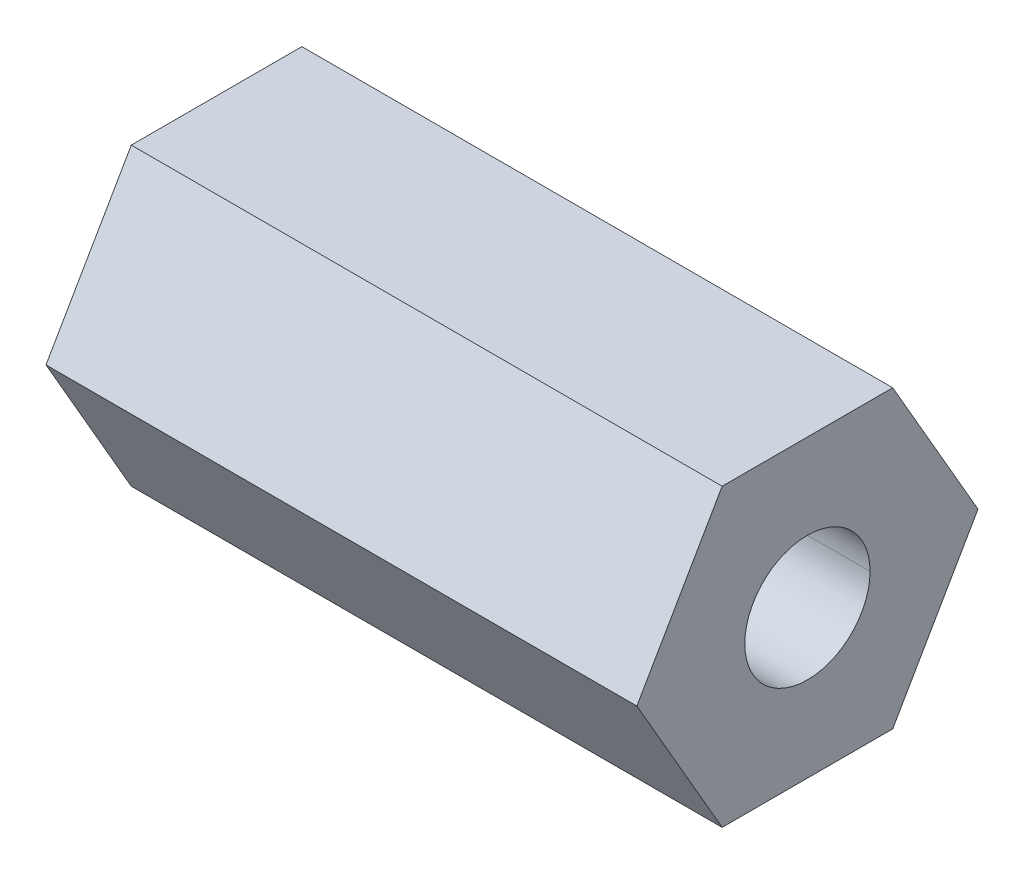
ISO-10303-21;
HEADER;
FILE_DESCRIPTION(('STEP AP214'),'2;1');
FILE_NAME('part.step','',(''),(''),'','','');
FILE_SCHEMA(('AUTOMOTIVE_DESIGN { 1 0 10303 214 1 1 1 1 }'));
ENDSEC;
DATA;
#1=APPLICATION_CONTEXT('core data for automotive mechanical design processes');
#2=APPLICATION_PROTOCOL_DEFINITION('international standard','automotive_design',2000,#1);
#3=PRODUCT_CONTEXT('',#1,'mechanical');
#4=PRODUCT('Part','Part','',(#3));
#5=PRODUCT_RELATED_PRODUCT_CATEGORY('part','',(#4));
#6=PRODUCT_DEFINITION_FORMATION('','',#4);
#7=PRODUCT_DEFINITION_CONTEXT('part definition',#1,'design');
#8=PRODUCT_DEFINITION('design','',#6,#7);
#9=PRODUCT_DEFINITION_SHAPE('','',#8);
#10=(LENGTH_UNIT() NAMED_UNIT(*) SI_UNIT(.MILLI.,.METRE.));
#11=(NAMED_UNIT(*) PLANE_ANGLE_UNIT() SI_UNIT($,.RADIAN.));
#12=(NAMED_UNIT(*) SI_UNIT($,.STERADIAN.) SOLID_ANGLE_UNIT());
#13=UNCERTAINTY_MEASURE_WITH_UNIT(LENGTH_MEASURE(1.E-05),#10,'distance_accuracy_value','');
#14=(GEOMETRIC_REPRESENTATION_CONTEXT(3) GLOBAL_UNCERTAINTY_ASSIGNED_CONTEXT((#13)) GLOBAL_UNIT_ASSIGNED_CONTEXT((#10,
#11,#12)) REPRESENTATION_CONTEXT('',''));
#15=CARTESIAN_POINT('',(0.,0.,0.));
#16=DIRECTION('',(0.,0.,1.));
#17=DIRECTION('',(1.,0.,0.));
#18=AXIS2_PLACEMENT_3D('',#15,#16,#17);
#19=CARTESIAN_POINT('',(38.1,-4.7625,-2.74963065701564));
#20=DIRECTION('',(0.,0.5,0.866025403784442));
#21=DIRECTION('',(1.,0.,0.));
#22=AXIS2_PLACEMENT_3D('',#19,#20,#21);
#23=PLANE('',#22);
#24=DIRECTION('',(0.,-0.866025403784444,0.499999999999991));
#25=VECTOR('',#24,1.);
#26=CARTESIAN_POINT('',(-19.05,-4.7625,-2.74963065701564));
#27=LINE('',#26,#25);
#28=CARTESIAN_POINT('',(-19.05,0.,-5.49926131403117));
#29=VERTEX_POINT('',#28);
#30=CARTESIAN_POINT('',(-19.05,-4.7625,-2.74963065701564));
#31=VERTEX_POINT('',#30);
#32=EDGE_CURVE('E46',#29,#31,#27,.T.);
#33=ORIENTED_EDGE('',*,*,#32,.T.);
#34=DIRECTION('',(-1.,0.,0.));
#35=VECTOR('',#34,1.);
#36=CARTESIAN_POINT('',(38.1,-4.7625,-2.74963065701564));
#37=LINE('',#36,#35);
#38=CARTESIAN_POINT('',(-38.1,-4.7625,-2.74963065701564));
#39=VERTEX_POINT('',#38);
#40=EDGE_CURVE('E128',#31,#39,#37,.T.);
#41=ORIENTED_EDGE('',*,*,#40,.T.);
#42=DIRECTION('',(0.,0.866025403784442,-0.5));
#43=VECTOR('',#42,1.);
#44=CARTESIAN_POINT('',(-38.1,-4.7625,-2.74963065701564));
#45=LINE('',#44,#43);
#46=CARTESIAN_POINT('',(-38.1,0.,-5.49926131403117));
#47=VERTEX_POINT('',#46);
#48=EDGE_CURVE('E160',#39,#47,#45,.T.);
#49=ORIENTED_EDGE('',*,*,#48,.T.);
#50=DIRECTION('',(-1.,0.,0.));
#51=VECTOR('',#50,1.);
#52=CARTESIAN_POINT('',(38.1,0.,-5.49926131403117));
#53=LINE('',#52,#51);
#54=EDGE_CURVE('E154',#29,#47,#53,.T.);
#55=ORIENTED_EDGE('',*,*,#54,.F.);
#56=EDGE_LOOP('',(#33,#41,#49,#55));
#57=FACE_BOUND('',#56,.T.);
#58=ADVANCED_FACE('F42',(#57),#23,.F.);
#59=CARTESIAN_POINT('',(38.1,0.,-5.49926131403117));
#60=DIRECTION('',(0.,-0.5,0.866025403784438));
#61=DIRECTION('',(-1.,0.,0.));
#62=AXIS2_PLACEMENT_3D('',#59,#60,#61);
#63=PLANE('',#62);
#64=DIRECTION('',(0.,-0.866025403784438,-0.500000000000001));
#65=VECTOR('',#64,1.);
#66=CARTESIAN_POINT('',(-19.05,0.,-5.49926131403117));
#67=LINE('',#66,#65);
#68=CARTESIAN_POINT('',(-19.05,4.7625,-2.74963065701557));
#69=VERTEX_POINT('',#68);
#70=EDGE_CURVE('E157',#69,#29,#67,.T.);
#71=ORIENTED_EDGE('',*,*,#70,.T.);
#72=ORIENTED_EDGE('',*,*,#54,.T.);
#73=DIRECTION('',(0.,0.866025403784438,0.5));
#74=VECTOR('',#73,1.);
#75=CARTESIAN_POINT('',(-38.1,0.,-5.49926131403117));
#76=LINE('',#75,#74);
#77=CARTESIAN_POINT('',(-38.1,4.7625,-2.74963065701557));
#78=VERTEX_POINT('',#77);
#79=EDGE_CURVE('E143',#47,#78,#76,.T.);
#80=ORIENTED_EDGE('',*,*,#79,.T.);
#81=DIRECTION('',(-1.,0.,0.));
#82=VECTOR('',#81,1.);
#83=CARTESIAN_POINT('',(38.1,4.7625,-2.74963065701557));
#84=LINE('',#83,#82);
#85=EDGE_CURVE('E146',#69,#78,#84,.T.);
#86=ORIENTED_EDGE('',*,*,#85,.F.);
#87=EDGE_LOOP('',(#71,#72,#80,#86));
#88=FACE_BOUND('',#87,.T.);
#89=ADVANCED_FACE('F334',(#88),#63,.F.);
#90=CARTESIAN_POINT('',(38.1,4.7625,-2.74963065701557));
#91=DIRECTION('',(0.,-1.,0.));
#92=DIRECTION('',(0.,0.,-1.));
#93=AXIS2_PLACEMENT_3D('',#90,#91,#92);
#94=PLANE('',#93);
#95=DIRECTION('',(0.,0.,-1.));
#96=VECTOR('',#95,1.);
#97=CARTESIAN_POINT('',(-19.05,4.7625,-2.74963065701557));
#98=LINE('',#97,#96);
#99=CARTESIAN_POINT('',(-19.05,4.7625,2.74963065701561));
#100=VERTEX_POINT('',#99);
#101=EDGE_CURVE('E150',#100,#69,#98,.T.);
#102=ORIENTED_EDGE('',*,*,#101,.T.);
#103=ORIENTED_EDGE('',*,*,#85,.T.);
#104=DIRECTION('',(0.,0.,1.));
#105=VECTOR('',#104,1.);
#106=CARTESIAN_POINT('',(-38.1,4.7625,-2.74963065701557));
#107=LINE('',#106,#105);
#108=CARTESIAN_POINT('',(-38.1,4.7625,2.7496306570156));
#109=VERTEX_POINT('',#108);
#110=EDGE_CURVE('E149',#78,#109,#107,.T.);
#111=ORIENTED_EDGE('',*,*,#110,.T.);
#112=DIRECTION('',(-1.,0.,0.));
#113=VECTOR('',#112,1.);
#114=CARTESIAN_POINT('',(38.1,4.7625,2.7496306570156));
#115=LINE('',#114,#113);
#116=EDGE_CURVE('E151',#100,#109,#115,.T.);
#117=ORIENTED_EDGE('',*,*,#116,.F.);
#118=EDGE_LOOP('',(#102,#103,#111,#117));
#119=FACE_BOUND('',#118,.T.);
#120=ADVANCED_FACE('F324',(#119),#94,.F.);
#121=CARTESIAN_POINT('',(38.1,4.7625,2.7496306570156));
#122=DIRECTION('',(0.,-0.5,-0.866025403784442));
#123=DIRECTION('',(0.,-0.866025403784442,0.5));
#124=AXIS2_PLACEMENT_3D('',#121,#122,#123);
#125=PLANE('',#124);
#126=DIRECTION('',(0.,0.866025403784443,-0.499999999999993));
#127=VECTOR('',#126,1.);
#128=CARTESIAN_POINT('',(-19.05,4.7625,2.7496306570156));
#129=LINE('',#128,#127);
#130=CARTESIAN_POINT('',(-19.05,0.,5.49926131403117));
#131=VERTEX_POINT('',#130);
#132=EDGE_CURVE('E115',#131,#100,#129,.T.);
#133=ORIENTED_EDGE('',*,*,#132,.T.);
#134=ORIENTED_EDGE('',*,*,#116,.T.);
#135=DIRECTION('',(0.,-0.866025403784442,0.5));
#136=VECTOR('',#135,1.);
#137=CARTESIAN_POINT('',(-38.1,4.7625,2.7496306570156));
#138=LINE('',#137,#136);
#139=CARTESIAN_POINT('',(-38.1,0.,5.49926131403117));
#140=VERTEX_POINT('',#139);
#141=EDGE_CURVE('E120',#109,#140,#138,.T.);
#142=ORIENTED_EDGE('',*,*,#141,.T.);
#143=DIRECTION('',(-1.,0.,0.));
#144=VECTOR('',#143,1.);
#145=CARTESIAN_POINT('',(38.1,0.,5.49926131403117));
#146=LINE('',#145,#144);
#147=EDGE_CURVE('E119',#131,#140,#146,.T.);
#148=ORIENTED_EDGE('',*,*,#147,.F.);
#149=EDGE_LOOP('',(#133,#134,#142,#148));
#150=FACE_BOUND('',#149,.T.);
#151=ADVANCED_FACE('F316',(#150),#125,.F.);
#152=CARTESIAN_POINT('',(38.1,0.,5.49926131403117));
#153=DIRECTION('',(0.,0.500000000000007,-0.866025403784435));
#154=DIRECTION('',(-1.,0.,0.));
#155=AXIS2_PLACEMENT_3D('',#152,#153,#154);
#156=PLANE('',#155);
#157=DIRECTION('',(0.,0.866025403784434,0.500000000000008));
#158=VECTOR('',#157,1.);
#159=CARTESIAN_POINT('',(-19.05,0.,5.49926131403117));
#160=LINE('',#159,#158);
#161=CARTESIAN_POINT('',(-19.05,-4.7625,2.74963065701554));
#162=VERTEX_POINT('',#161);
#163=EDGE_CURVE('E109',#162,#131,#160,.T.);
#164=ORIENTED_EDGE('',*,*,#163,.T.);
#165=ORIENTED_EDGE('',*,*,#147,.T.);
#166=DIRECTION('',(0.,-0.866025403784435,-0.500000000000007));
#167=VECTOR('',#166,1.);
#168=CARTESIAN_POINT('',(-38.1,0.,5.49926131403117));
#169=LINE('',#168,#167);
#170=CARTESIAN_POINT('',(-38.1,-4.7625,2.74963065701554));
#171=VERTEX_POINT('',#170);
#172=EDGE_CURVE('E129',#140,#171,#169,.T.);
#173=ORIENTED_EDGE('',*,*,#172,.T.);
#174=DIRECTION('',(-1.,0.,0.));
#175=VECTOR('',#174,1.);
#176=CARTESIAN_POINT('',(38.1,-4.7625,2.74963065701554));
#177=LINE('',#176,#175);
#178=EDGE_CURVE('E126',#162,#171,#177,.T.);
#179=ORIENTED_EDGE('',*,*,#178,.F.);
#180=EDGE_LOOP('',(#164,#165,#173,#179));
#181=FACE_BOUND('',#180,.T.);
#182=ADVANCED_FACE('F132',(#181),#156,.F.);
#183=CARTESIAN_POINT('',(38.1,-4.7625,2.74963065701554));
#184=DIRECTION('',(0.,1.,0.));
#185=DIRECTION('',(0.,0.,-1.));
#186=AXIS2_PLACEMENT_3D('',#183,#184,#185);
#187=PLANE('',#186);
#188=DIRECTION('',(0.,0.,1.));
#189=VECTOR('',#188,1.);
#190=CARTESIAN_POINT('',(-19.05,-4.7625,2.74963065701554));
#191=LINE('',#190,#189);
#192=EDGE_CURVE('E112',#31,#162,#191,.T.);
#193=ORIENTED_EDGE('',*,*,#192,.T.);
#194=ORIENTED_EDGE('',*,*,#178,.T.);
#195=DIRECTION('',(0.,0.,-1.));
#196=VECTOR('',#195,1.);
#197=CARTESIAN_POINT('',(-38.1,-4.7625,2.74963065701554));
#198=LINE('',#197,#196);
#199=EDGE_CURVE('E135',#171,#39,#198,.T.);
#200=ORIENTED_EDGE('',*,*,#199,.T.);
#201=ORIENTED_EDGE('',*,*,#40,.F.);
#202=EDGE_LOOP('',(#193,#194,#200,#201));
#203=FACE_BOUND('',#202,.T.);
#204=ADVANCED_FACE('F124',(#203),#187,.F.);
#205=CARTESIAN_POINT('',(-38.1,0.,0.));
#206=DIRECTION('',(1.,0.,0.));
#207=DIRECTION('',(0.,1.,0.));
#208=AXIS2_PLACEMENT_3D('',#205,#206,#207);
#209=PLANE('',#208);
#210=CARTESIAN_POINT('',(-38.1,0.,0.));
#211=DIRECTION('',(-1.,0.,0.));
#212=DIRECTION('',(0.,0.,1.));
#213=AXIS2_PLACEMENT_3D('',#210,#211,#212);
#214=CIRCLE('',#213,2.0193);
#215=CARTESIAN_POINT('',(-38.1,0.,2.0193));
#216=VERTEX_POINT('',#215);
#217=CARTESIAN_POINT('',(-38.1,0.,-2.0193));
#218=VERTEX_POINT('',#217);
#219=EDGE_CURVE('E170',#216,#218,#214,.T.);
#220=ORIENTED_EDGE('',*,*,#219,.F.);
#221=CARTESIAN_POINT('',(-38.1,0.,0.));
#222=DIRECTION('',(-1.,0.,0.));
#223=DIRECTION('',(0.,0.,1.));
#224=AXIS2_PLACEMENT_3D('',#221,#222,#223);
#225=CIRCLE('',#224,2.0193);
#226=EDGE_CURVE('E169',#218,#216,#225,.T.);
#227=ORIENTED_EDGE('',*,*,#226,.F.);
#228=EDGE_LOOP('',(#220,#227));
#229=FACE_BOUND('',#228,.T.);
#230=ORIENTED_EDGE('',*,*,#48,.F.);
#231=ORIENTED_EDGE('',*,*,#199,.F.);
#232=ORIENTED_EDGE('',*,*,#172,.F.);
#233=ORIENTED_EDGE('',*,*,#141,.F.);
#234=ORIENTED_EDGE('',*,*,#110,.F.);
#235=ORIENTED_EDGE('',*,*,#79,.F.);
#236=EDGE_LOOP('',(#230,#231,#232,#233,#234,#235));
#237=FACE_BOUND('',#236,.T.);
#238=ADVANCED_FACE('F208',(#229,#237),#209,.F.);
#239=CARTESIAN_POINT('',(-38.1,0.,0.));
#240=DIRECTION('',(-1.,0.,0.));
#241=DIRECTION('',(0.,0.,1.));
#242=AXIS2_PLACEMENT_3D('',#239,#240,#241);
#243=CYLINDRICAL_SURFACE('',#242,2.0193);
#244=CARTESIAN_POINT('',(-19.05,0.,0.));
#245=DIRECTION('',(1.,0.,0.));
#246=DIRECTION('',(0.,0.,-1.));
#247=AXIS2_PLACEMENT_3D('',#244,#245,#246);
#248=CIRCLE('',#247,2.0193);
#249=CARTESIAN_POINT('',(-19.05,0.,-2.0193));
#250=VERTEX_POINT('',#249);
#251=CARTESIAN_POINT('',(-19.05,0.,2.0193));
#252=VERTEX_POINT('',#251);
#253=EDGE_CURVE('E52',#250,#252,#248,.F.);
#254=ORIENTED_EDGE('',*,*,#253,.F.);
#255=DIRECTION('',(-1.,0.,0.));
#256=VECTOR('',#255,1.);
#257=CARTESIAN_POINT('',(-38.1,0.,-2.0193));
#258=LINE('',#257,#256);
#259=EDGE_CURVE('E140',#250,#218,#258,.T.);
#260=ORIENTED_EDGE('',*,*,#259,.T.);
#261=ORIENTED_EDGE('',*,*,#226,.T.);
#262=DIRECTION('',(-1.,0.,0.));
#263=VECTOR('',#262,1.);
#264=CARTESIAN_POINT('',(-38.1,0.,2.0193));
#265=LINE('',#264,#263);
#266=EDGE_CURVE('E191',#252,#216,#265,.T.);
#267=ORIENTED_EDGE('',*,*,#266,.F.);
#268=EDGE_LOOP('',(#254,#260,#261,#267));
#269=FACE_BOUND('',#268,.T.);
#270=ADVANCED_FACE('F206',(#269),#243,.F.);
#271=CARTESIAN_POINT('',(-38.1,0.,0.));
#272=DIRECTION('',(-1.,0.,0.));
#273=DIRECTION('',(0.,0.,1.));
#274=AXIS2_PLACEMENT_3D('',#271,#272,#273);
#275=CYLINDRICAL_SURFACE('',#274,2.0193);
#276=EDGE_CURVE('E11',#252,#250,#248,.F.);
#277=ORIENTED_EDGE('',*,*,#276,.F.);
#278=ORIENTED_EDGE('',*,*,#266,.T.);
#279=ORIENTED_EDGE('',*,*,#219,.T.);
#280=ORIENTED_EDGE('',*,*,#259,.F.);
#281=EDGE_LOOP('',(#277,#278,#279,#280));
#282=FACE_BOUND('',#281,.T.);
#283=ADVANCED_FACE('F280',(#282),#275,.F.);
#284=CARTESIAN_POINT('',(-19.05,0.,0.));
#285=DIRECTION('',(1.,0.,0.));
#286=DIRECTION('',(0.,1.,0.));
#287=AXIS2_PLACEMENT_3D('',#284,#285,#286);
#288=PLANE('',#287);
#289=ORIENTED_EDGE('',*,*,#192,.F.);
#290=ORIENTED_EDGE('',*,*,#32,.F.);
#291=ORIENTED_EDGE('',*,*,#70,.F.);
#292=ORIENTED_EDGE('',*,*,#101,.F.);
#293=ORIENTED_EDGE('',*,*,#132,.F.);
#294=ORIENTED_EDGE('',*,*,#163,.F.);
#295=EDGE_LOOP('',(#289,#290,#291,#292,#293,#294));
#296=FACE_BOUND('',#295,.T.);
#297=ORIENTED_EDGE('',*,*,#253,.T.);
#298=ORIENTED_EDGE('',*,*,#276,.T.);
#299=EDGE_LOOP('',(#297,#298));
#300=FACE_BOUND('',#299,.T.);
#301=ADVANCED_FACE('F44',(#296,#300),#288,.T.);
#302=CLOSED_SHELL('',(#58,#89,#120,#151,#182,#204,#238,#270,#283,#301));
#303=MANIFOLD_SOLID_BREP('B2',#302);
#304=ADVANCED_BREP_SHAPE_REPRESENTATION('',(#18,#303),#14);
#305=SHAPE_DEFINITION_REPRESENTATION(#9,#304);
ENDSEC;
END-ISO-10303-21;
